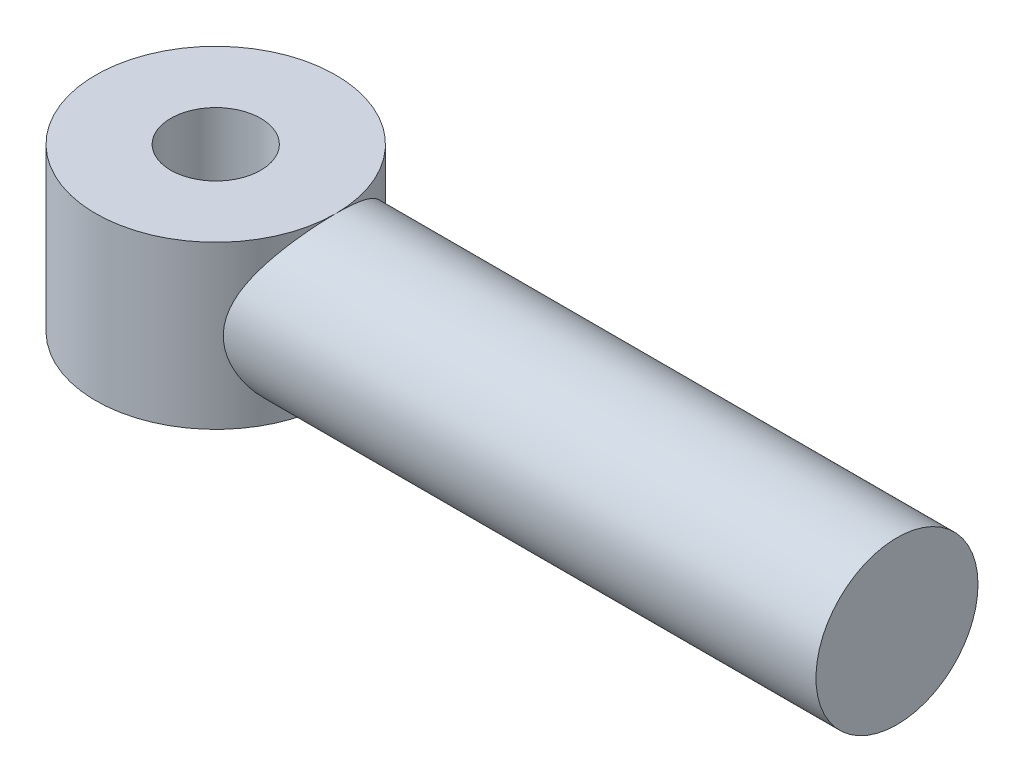
ISO-10303-21;
HEADER;
FILE_DESCRIPTION(('STEP AP214'),'2;1');
FILE_NAME('part.step','',(''),(''),'','','');
FILE_SCHEMA(('AUTOMOTIVE_DESIGN { 1 0 10303 214 1 1 1 1 }'));
ENDSEC;
DATA;
#1=APPLICATION_CONTEXT('core data for automotive mechanical design processes');
#2=APPLICATION_PROTOCOL_DEFINITION('international standard','automotive_design',2000,#1);
#3=PRODUCT_CONTEXT('',#1,'mechanical');
#4=PRODUCT('Part','Part','',(#3));
#5=PRODUCT_RELATED_PRODUCT_CATEGORY('part','',(#4));
#6=PRODUCT_DEFINITION_FORMATION('','',#4);
#7=PRODUCT_DEFINITION_CONTEXT('part definition',#1,'design');
#8=PRODUCT_DEFINITION('design','',#6,#7);
#9=PRODUCT_DEFINITION_SHAPE('','',#8);
#10=(LENGTH_UNIT() NAMED_UNIT(*) SI_UNIT(.MILLI.,.METRE.));
#11=(NAMED_UNIT(*) PLANE_ANGLE_UNIT() SI_UNIT($,.RADIAN.));
#12=(NAMED_UNIT(*) SI_UNIT($,.STERADIAN.) SOLID_ANGLE_UNIT());
#13=UNCERTAINTY_MEASURE_WITH_UNIT(LENGTH_MEASURE(1.E-05),#10,'distance_accuracy_value','');
#14=(GEOMETRIC_REPRESENTATION_CONTEXT(3) GLOBAL_UNCERTAINTY_ASSIGNED_CONTEXT((#13)) GLOBAL_UNIT_ASSIGNED_CONTEXT((#10,
#11,#12)) REPRESENTATION_CONTEXT('',''));
#15=CARTESIAN_POINT('',(0.,0.,0.));
#16=DIRECTION('',(0.,0.,1.));
#17=DIRECTION('',(1.,0.,0.));
#18=AXIS2_PLACEMENT_3D('',#15,#16,#17);
#19=CARTESIAN_POINT('',(0.,-1.35,0.));
#20=DIRECTION('',(0.,1.,0.));
#21=DIRECTION('',(0.,0.,1.));
#22=AXIS2_PLACEMENT_3D('',#19,#20,#21);
#23=CYLINDRICAL_SURFACE('',#22,2.);
#24=CARTESIAN_POINT('',(1.47563545633737,0.,1.35));
#25=CARTESIAN_POINT('',(1.47564026691465,-0.0656361310385243,1.34999732420168));
#26=CARTESIAN_POINT('',(1.48009661603018,-0.131287682107847,1.34517179869902));
#27=CARTESIAN_POINT('',(1.49702923221897,-0.260220205950425,1.32629252592756));
#28=CARTESIAN_POINT('',(1.5095201927819,-0.323496610276954,1.31222187038928));
#29=CARTESIAN_POINT('',(1.54026628541883,-0.445397154681995,1.2759826490888));
#30=CARTESIAN_POINT('',(1.55846335198277,-0.504061023675245,1.25389531953543));
#31=CARTESIAN_POINT('',(1.59846705065036,-0.616746528371873,1.20248218253732));
#32=CARTESIAN_POINT('',(1.62027431953554,-0.67076734255696,1.17315509766735));
#33=CARTESIAN_POINT('',(1.66922745479269,-0.782118778996489,1.10263439367894));
#34=CARTESIAN_POINT('',(1.69666877551896,-0.838592168053739,1.06029221829813));
#35=CARTESIAN_POINT('',(1.75137657382538,-0.944387563807067,0.96726376896539));
#36=CARTESIAN_POINT('',(1.77864282258708,-0.99370153413127,0.916568252632395));
#37=CARTESIAN_POINT('',(1.83473549055454,-1.09113272182204,0.799117849117702));
#38=CARTESIAN_POINT('',(1.86318254027222,-1.13796109271406,0.731094717715901));
#39=CARTESIAN_POINT('',(1.91380124437491,-1.21907232112646,0.585869065255354));
#40=CARTESIAN_POINT('',(1.93598441912717,-1.25337824411106,0.508683771480743));
#41=CARTESIAN_POINT('',(1.96684186009757,-1.30045868648688,0.367887079950249));
#42=CARTESIAN_POINT('',(1.97751499601598,-1.31648666181344,0.305793694725354));
#43=CARTESIAN_POINT('',(1.99296672124338,-1.33958657955992,0.179257797884657));
#44=CARTESIAN_POINT('',(1.99774979885466,-1.34666534150843,0.114817113544264));
#45=CARTESIAN_POINT('',(2.00099657859575,-1.35147709185853,-0.0146800918737847));
#46=CARTESIAN_POINT('',(1.99944987251041,-1.34919468745616,-0.0797374516183555));
#47=CARTESIAN_POINT('',(1.99015771322951,-1.33538510976815,-0.208414094969865));
#48=CARTESIAN_POINT('',(1.98241043044546,-1.32385520784465,-0.272032948422415));
#49=CARTESIAN_POINT('',(1.9615800665645,-1.29245156273958,-0.395005279974246));
#50=CARTESIAN_POINT('',(1.94859293368168,-1.27272767848666,-0.454413991192183));
#51=CARTESIAN_POINT('',(1.91827299779078,-1.22580231568083,-0.568986160192639));
#52=CARTESIAN_POINT('',(1.90093937183117,-1.1985994209811,-0.624148811451386));
#53=CARTESIAN_POINT('',(1.86092917749303,-1.13413775969902,-0.735404309013813));
#54=CARTESIAN_POINT('',(1.8378705806877,-1.09609110372573,-0.79090104509674));
#55=CARTESIAN_POINT('',(1.78943956123519,-1.0127898473593,-0.895106413322229));
#56=CARTESIAN_POINT('',(1.7640644537615,-0.96752683672349,-0.943806999201833));
#57=CARTESIAN_POINT('',(1.70848934094248,-0.862413217887569,-1.04149990873228));
#58=CARTESIAN_POINT('',(1.67819203542626,-0.801388934901284,-1.08917936904103));
#59=CARTESIAN_POINT('',(1.62008697606809,-0.671242873376665,-1.17386185140333));
#60=CARTESIAN_POINT('',(1.59227774397068,-0.602125960088841,-1.21087124237962));
#61=CARTESIAN_POINT('',(1.54897226188686,-0.47384937916382,-1.26554406077341));
#62=CARTESIAN_POINT('',(1.53212027970594,-0.416223148456476,-1.28571456706783));
#63=CARTESIAN_POINT('',(1.50422513619352,-0.297494964591519,-1.31824520551447));
#64=CARTESIAN_POINT('',(1.49317143225253,-0.236399545044569,-1.33061952124094));
#65=CARTESIAN_POINT('',(1.47855235851908,-0.111655416993093,-1.34685276857582));
#66=CARTESIAN_POINT('',(1.47504668787708,-0.0479903812786213,-1.35064382523412));
#67=CARTESIAN_POINT('',(1.47638871059085,0.0791498318487602,-1.3491763703727));
#68=CARTESIAN_POINT('',(1.48123695492846,0.142624996462133,-1.34391726195007));
#69=CARTESIAN_POINT('',(1.4974192707672,0.260403867476928,-1.32584145851697));
#70=CARTESIAN_POINT('',(1.5079944097321,0.314956560257622,-1.31390453310863));
#71=CARTESIAN_POINT('',(1.53370174348238,0.421192533671927,-1.28380301759109));
#72=CARTESIAN_POINT('',(1.54883805437549,0.472873172393156,-1.26563280035558));
#73=CARTESIAN_POINT('',(1.58969841672514,0.5952401260783,-1.21423164019257));
#74=CARTESIAN_POINT('',(1.61712665232682,0.664057422926864,-1.17790082375768));
#75=CARTESIAN_POINT('',(1.6745917302945,0.79382115141312,-1.09467263194285));
#76=CARTESIAN_POINT('',(1.70463329063373,0.854752832038322,-1.04775589133952));
#77=CARTESIAN_POINT('',(1.76453287425234,0.968736704294471,-0.943446462837683));
#78=CARTESIAN_POINT('',(1.79438325717599,1.02167443297271,-0.885923825968593));
#79=CARTESIAN_POINT('',(1.85058210539834,1.11743110506505,-0.761567463861282));
#80=CARTESIAN_POINT('',(1.87693612878186,1.160266194829,-0.694748871253988));
#81=CARTESIAN_POINT('',(1.91934081004795,1.2275668581877,-0.56559125583412));
#82=CARTESIAN_POINT('',(1.93639085449593,1.25394634244385,-0.504580201758791));
#83=CARTESIAN_POINT('',(1.96498715140986,1.29767085894497,-0.378170991137798));
#84=CARTESIAN_POINT('',(1.97653694679693,1.3150217075495,-0.312775689711188));
#85=CARTESIAN_POINT('',(1.99311978097916,1.339818126691,-0.178981896873097));
#86=CARTESIAN_POINT('',(1.99812242312901,1.34721749959955,-0.110570911082546));
#87=CARTESIAN_POINT('',(2.00099878034373,1.35148040860764,0.0267281927315808));
#88=CARTESIAN_POINT('',(1.99887377197404,1.34834583134225,0.0956162231109367));
#89=CARTESIAN_POINT('',(1.98816037210713,1.33240814360407,0.226230617830357));
#90=CARTESIAN_POINT('',(1.98008784702276,1.32037644663174,0.288097111486507));
#91=CARTESIAN_POINT('',(1.9587516642586,1.2881589078289,0.408712263722611));
#92=CARTESIAN_POINT('',(1.9454871774185,1.26797176355058,0.467460422599447));
#93=CARTESIAN_POINT('',(1.91392004278759,1.21899930286879,0.583722715440871));
#94=CARTESIAN_POINT('',(1.89538595679137,1.18981200886351,0.641002961986215));
#95=CARTESIAN_POINT('',(1.85495830265362,1.12429301553525,0.750010316877194));
#96=CARTESIAN_POINT('',(1.83306287503682,1.08795735862714,0.801734324457559));
#97=CARTESIAN_POINT('',(1.78368749549466,1.00271495792877,0.906828909437024));
#98=CARTESIAN_POINT('',(1.75587199698784,0.952728895060075,0.95916608952162));
#99=CARTESIAN_POINT('',(1.69989769519387,0.8451432281624,1.05519630014687));
#100=CARTESIAN_POINT('',(1.67173862480962,0.787537305958146,1.09888208129481));
#101=CARTESIAN_POINT('',(1.61931138442906,0.668834902916405,1.17466084938706));
#102=CARTESIAN_POINT('',(1.59491240437551,0.608132484362593,1.20727785967788));
#103=CARTESIAN_POINT('',(1.55091683650936,0.481014743936821,1.26330069044648));
#104=CARTESIAN_POINT('',(1.53131191811061,0.414609606955745,1.28672253277991));
#105=CARTESIAN_POINT('',(1.5029638690468,0.290371221650683,1.31965219994731));
#106=CARTESIAN_POINT('',(1.49285880771211,0.233335991535785,1.33096688803776));
#107=CARTESIAN_POINT('',(1.47919629238173,0.117536553636644,1.34613760611656));
#108=CARTESIAN_POINT('',(1.47563114866303,0.0587744590685644,1.35000239606748));
#109=CARTESIAN_POINT('',(1.47563545633737,0.,1.35));
#110=B_SPLINE_CURVE_WITH_KNOTS('',3,(#24,#25,#26,#27,#28,#29,#30,#31,#32,#33,#34,#35,#36,#37,
#38,#39,#40,#41,#42,#43,#44,#45,#46,#47,#48,#49,#50,#51,#52,#53,#54,#55,#56,#57,#58,#59,#60,#61,
#62,#63,#64,#65,#66,#67,#68,#69,#70,#71,#72,#73,#74,#75,#76,#77,#78,#79,#80,#81,#82,#83,#84,#85,
#86,#87,#88,#89,#90,#91,#92,#93,#94,#95,#96,#97,#98,#99,#100,#101,#102,#103,#104,#105,#106,#107,
#108,#109),.UNSPECIFIED.,.T.,.F.,(4,2,2,2,2,2,2,2,2,2,2,2,2,2,2,2,2,2,2,2,2,2,2,2,2,2,2,2,2,2,2,
2,2,2,2,2,2,2,2,2,2,2,4),(0.,0.196638578594613,0.393637791097073,0.588694053424219,
0.783784757262221,1.01014392904437,1.23675525401583,1.4973550068482,1.75747230186428,
1.95166111458761,2.14570186111812,2.34006180159418,2.53447911251944,2.72548721585802,
2.91653151142186,3.1291115865236,3.34194124719866,3.59035837057579,3.83862690628886,
4.02793538917255,4.21689846184042,4.40735067953033,4.59781545896238,4.76766167493796,
4.93766162545025,5.18389031119257,5.43057313764477,5.68050793807616,5.9300405362879,
6.13504984296117,6.3399269160683,6.54575184223072,6.75153990702395,6.9413130300531,
7.13111647237063,7.33106720770747,7.53112895592312,7.76283198324929,7.99472835090457,
8.21322440278307,8.43133803461733,8.60762722038806,8.78370898977398),.UNSPECIFIED.);
#111=CARTESIAN_POINT('',(2.,-1.35,0.));
#112=VERTEX_POINT('',#111);
#113=CARTESIAN_POINT('',(2.,1.35,0.));
#114=VERTEX_POINT('',#113);
#115=EDGE_CURVE('E11',#112,#114,#110,.T.);
#116=ORIENTED_EDGE('',*,*,#115,.F.);
#117=CARTESIAN_POINT('',(0.,-1.35,0.));
#118=DIRECTION('',(0.,1.,0.));
#119=DIRECTION('',(0.,0.,1.));
#120=AXIS2_PLACEMENT_3D('',#117,#118,#119);
#121=CIRCLE('',#120,2.);
#122=EDGE_CURVE('E58',#112,#112,#121,.T.);
#123=ORIENTED_EDGE('',*,*,#122,.T.);
#124=EDGE_CURVE('E44',#114,#112,#110,.T.);
#125=ORIENTED_EDGE('',*,*,#124,.F.);
#126=CARTESIAN_POINT('',(0.,1.35,0.));
#127=DIRECTION('',(0.,1.,0.));
#128=DIRECTION('',(0.,0.,1.));
#129=AXIS2_PLACEMENT_3D('',#126,#127,#128);
#130=CIRCLE('',#129,2.);
#131=EDGE_CURVE('E65',#114,#114,#130,.T.);
#132=ORIENTED_EDGE('',*,*,#131,.F.);
#133=EDGE_LOOP('',(#116,#123,#125,#132));
#134=FACE_BOUND('',#133,.T.);
#135=ADVANCED_FACE('F39',(#134),#23,.T.);
#136=CARTESIAN_POINT('',(0.,-1.35,0.));
#137=DIRECTION('',(0.,1.,0.));
#138=DIRECTION('',(0.,0.,1.));
#139=AXIS2_PLACEMENT_3D('',#136,#137,#138);
#140=PLANE('',#139);
#141=CARTESIAN_POINT('',(0.,-1.35,0.));
#142=DIRECTION('',(0.,1.,0.));
#143=DIRECTION('',(0.,0.,1.));
#144=AXIS2_PLACEMENT_3D('',#141,#142,#143);
#145=CIRCLE('',#144,0.75);
#146=CARTESIAN_POINT('',(0.,-1.35,0.749999999999999));
#147=VERTEX_POINT('',#146);
#148=EDGE_CURVE('E72',#147,#147,#145,.T.);
#149=ORIENTED_EDGE('',*,*,#148,.T.);
#150=EDGE_LOOP('',(#149));
#151=FACE_BOUND('',#150,.T.);
#152=ORIENTED_EDGE('',*,*,#122,.F.);
#153=EDGE_LOOP('',(#152));
#154=FACE_BOUND('',#153,.T.);
#155=ADVANCED_FACE('F93',(#151,#154),#140,.F.);
#156=CARTESIAN_POINT('',(0.,1.35,0.));
#157=DIRECTION('',(0.,1.,0.));
#158=DIRECTION('',(0.,0.,1.));
#159=AXIS2_PLACEMENT_3D('',#156,#157,#158);
#160=PLANE('',#159);
#161=CARTESIAN_POINT('',(0.,1.35,0.));
#162=DIRECTION('',(0.,1.,0.));
#163=DIRECTION('',(0.,0.,1.));
#164=AXIS2_PLACEMENT_3D('',#161,#162,#163);
#165=CIRCLE('',#164,0.75);
#166=CARTESIAN_POINT('',(0.,1.35,0.749999999999999));
#167=VERTEX_POINT('',#166);
#168=EDGE_CURVE('E78',#167,#167,#165,.T.);
#169=ORIENTED_EDGE('',*,*,#168,.F.);
#170=EDGE_LOOP('',(#169));
#171=FACE_BOUND('',#170,.T.);
#172=ORIENTED_EDGE('',*,*,#131,.T.);
#173=EDGE_LOOP('',(#172));
#174=FACE_BOUND('',#173,.T.);
#175=ADVANCED_FACE('F70',(#171,#174),#160,.T.);
#176=CARTESIAN_POINT('',(11.35,0.,0.));
#177=DIRECTION('',(-1.,0.,0.));
#178=DIRECTION('',(0.,0.,1.));
#179=AXIS2_PLACEMENT_3D('',#176,#177,#178);
#180=CYLINDRICAL_SURFACE('',#179,1.35);
#181=CARTESIAN_POINT('',(11.35,0.,0.));
#182=DIRECTION('',(1.,0.,0.));
#183=DIRECTION('',(0.,0.,-1.));
#184=AXIS2_PLACEMENT_3D('',#181,#182,#183);
#185=CIRCLE('',#184,1.35);
#186=CARTESIAN_POINT('',(11.35,0.,-1.35));
#187=VERTEX_POINT('',#186);
#188=EDGE_CURVE('E68',#187,#187,#185,.T.);
#189=ORIENTED_EDGE('',*,*,#188,.F.);
#190=EDGE_LOOP('',(#189));
#191=FACE_BOUND('',#190,.T.);
#192=ORIENTED_EDGE('',*,*,#124,.T.);
#193=ORIENTED_EDGE('',*,*,#115,.T.);
#194=EDGE_LOOP('',(#192,#193));
#195=FACE_BOUND('',#194,.T.);
#196=ADVANCED_FACE('F41',(#191,#195),#180,.T.);
#197=CARTESIAN_POINT('',(11.35,0.,0.));
#198=DIRECTION('',(1.,0.,0.));
#199=DIRECTION('',(0.,0.,-1.));
#200=AXIS2_PLACEMENT_3D('',#197,#198,#199);
#201=PLANE('',#200);
#202=ORIENTED_EDGE('',*,*,#188,.T.);
#203=EDGE_LOOP('',(#202));
#204=FACE_BOUND('',#203,.T.);
#205=ADVANCED_FACE('F85',(#204),#201,.T.);
#206=CARTESIAN_POINT('',(0.,-10.,0.));
#207=DIRECTION('',(0.,1.,0.));
#208=DIRECTION('',(0.,0.,1.));
#209=AXIS2_PLACEMENT_3D('',#206,#207,#208);
#210=CYLINDRICAL_SURFACE('',#209,0.75);
#211=ORIENTED_EDGE('',*,*,#168,.T.);
#212=EDGE_LOOP('',(#211));
#213=FACE_BOUND('',#212,.T.);
#214=ORIENTED_EDGE('',*,*,#148,.F.);
#215=EDGE_LOOP('',(#214));
#216=FACE_BOUND('',#215,.T.);
#217=ADVANCED_FACE('F92',(#213,#216),#210,.F.);
#218=CLOSED_SHELL('',(#135,#155,#175,#196,#205,#217));
#219=MANIFOLD_SOLID_BREP('B2',#218);
#220=ADVANCED_BREP_SHAPE_REPRESENTATION('',(#18,#219),#14);
#221=SHAPE_DEFINITION_REPRESENTATION(#9,#220);
ENDSEC;
END-ISO-10303-21;
